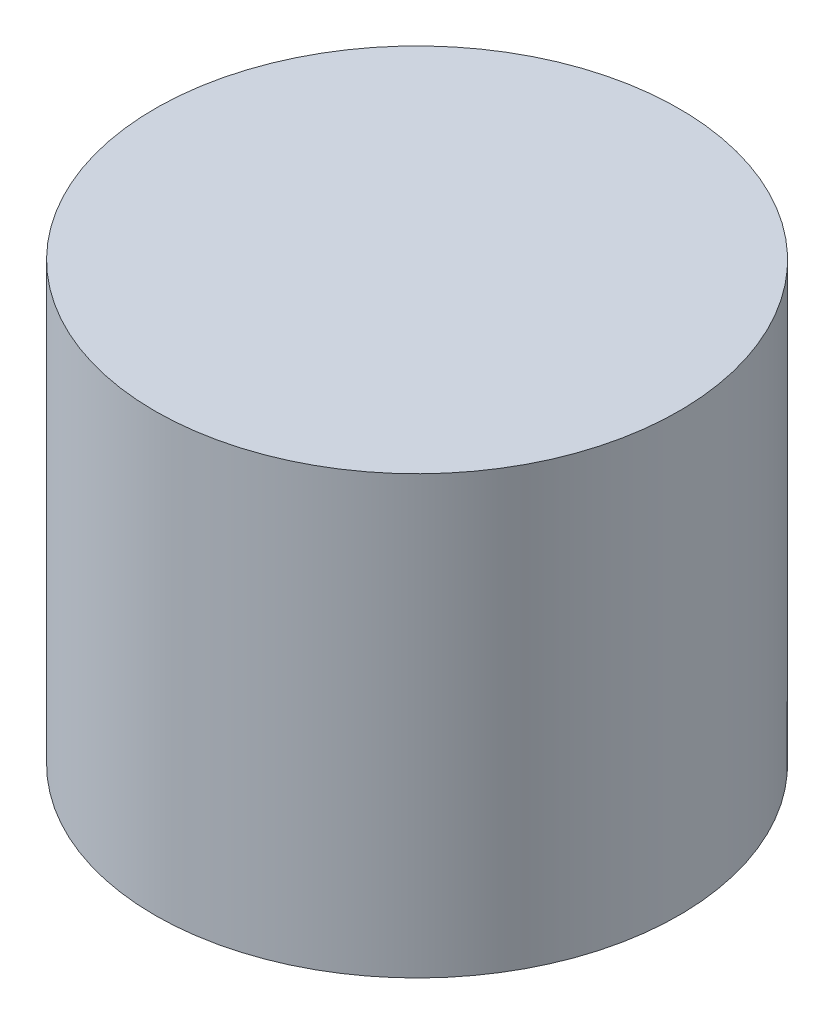
ISO-10303-21;
HEADER;
FILE_DESCRIPTION(('STEP AP214'),'2;1');
FILE_NAME('part.step','',(''),(''),'','','');
FILE_SCHEMA(('AUTOMOTIVE_DESIGN { 1 0 10303 214 1 1 1 1 }'));
ENDSEC;
DATA;
#1=APPLICATION_CONTEXT('core data for automotive mechanical design processes');
#2=APPLICATION_PROTOCOL_DEFINITION('international standard','automotive_design',2000,#1);
#3=PRODUCT_CONTEXT('',#1,'mechanical');
#4=PRODUCT('Part','Part','',(#3));
#5=PRODUCT_RELATED_PRODUCT_CATEGORY('part','',(#4));
#6=PRODUCT_DEFINITION_FORMATION('','',#4);
#7=PRODUCT_DEFINITION_CONTEXT('part definition',#1,'design');
#8=PRODUCT_DEFINITION('design','',#6,#7);
#9=PRODUCT_DEFINITION_SHAPE('','',#8);
#10=(LENGTH_UNIT() NAMED_UNIT(*) SI_UNIT(.MILLI.,.METRE.));
#11=(NAMED_UNIT(*) PLANE_ANGLE_UNIT() SI_UNIT($,.RADIAN.));
#12=(NAMED_UNIT(*) SI_UNIT($,.STERADIAN.) SOLID_ANGLE_UNIT());
#13=UNCERTAINTY_MEASURE_WITH_UNIT(LENGTH_MEASURE(1.E-05),#10,'distance_accuracy_value','');
#14=(GEOMETRIC_REPRESENTATION_CONTEXT(3) GLOBAL_UNCERTAINTY_ASSIGNED_CONTEXT((#13)) GLOBAL_UNIT_ASSIGNED_CONTEXT((#10,
#11,#12)) REPRESENTATION_CONTEXT('',''));
#15=CARTESIAN_POINT('',(0.,0.,0.));
#16=DIRECTION('',(0.,0.,1.));
#17=DIRECTION('',(1.,0.,0.));
#18=AXIS2_PLACEMENT_3D('',#15,#16,#17);
#19=CARTESIAN_POINT('',(0.,25.,0.));
#20=DIRECTION('',(0.,-1.,0.));
#21=DIRECTION('',(0.,0.,-1.));
#22=AXIS2_PLACEMENT_3D('',#19,#20,#21);
#23=CYLINDRICAL_SURFACE('',#22,15.);
#24=CARTESIAN_POINT('',(0.,25.,0.));
#25=DIRECTION('',(0.,1.,0.));
#26=DIRECTION('',(0.,0.,1.));
#27=AXIS2_PLACEMENT_3D('',#24,#25,#26);
#28=CIRCLE('',#27,15.);
#29=CARTESIAN_POINT('',(0.,25.,15.));
#30=VERTEX_POINT('',#29);
#31=EDGE_CURVE('E10',#30,#30,#28,.T.);
#32=ORIENTED_EDGE('',*,*,#31,.F.);
#33=EDGE_LOOP('',(#32));
#34=FACE_BOUND('',#33,.T.);
#35=CARTESIAN_POINT('',(0.,0.,0.));
#36=DIRECTION('',(0.,1.,0.));
#37=DIRECTION('',(0.,0.,1.));
#38=AXIS2_PLACEMENT_3D('',#35,#36,#37);
#39=CIRCLE('',#38,15.);
#40=CARTESIAN_POINT('',(0.,0.,15.));
#41=VERTEX_POINT('',#40);
#42=EDGE_CURVE('E35',#41,#41,#39,.T.);
#43=ORIENTED_EDGE('',*,*,#42,.T.);
#44=EDGE_LOOP('',(#43));
#45=FACE_BOUND('',#44,.T.);
#46=ADVANCED_FACE('F32',(#34,#45),#23,.T.);
#47=CARTESIAN_POINT('',(0.,25.,0.));
#48=DIRECTION('',(0.,1.,0.));
#49=DIRECTION('',(0.,0.,1.));
#50=AXIS2_PLACEMENT_3D('',#47,#48,#49);
#51=PLANE('',#50);
#52=ORIENTED_EDGE('',*,*,#31,.T.);
#53=EDGE_LOOP('',(#52));
#54=FACE_BOUND('',#53,.T.);
#55=ADVANCED_FACE('F47',(#54),#51,.T.);
#56=CARTESIAN_POINT('',(0.,0.,0.));
#57=DIRECTION('',(0.,1.,0.));
#58=DIRECTION('',(0.,0.,1.));
#59=AXIS2_PLACEMENT_3D('',#56,#57,#58);
#60=PLANE('',#59);
#61=ORIENTED_EDGE('',*,*,#42,.F.);
#62=EDGE_LOOP('',(#61));
#63=FACE_BOUND('',#62,.T.);
#64=ADVANCED_FACE('F45',(#63),#60,.F.);
#65=CLOSED_SHELL('',(#46,#55,#64));
#66=MANIFOLD_SOLID_BREP('B2',#65);
#67=ADVANCED_BREP_SHAPE_REPRESENTATION('',(#18,#66),#14);
#68=SHAPE_DEFINITION_REPRESENTATION(#9,#67);
ENDSEC;
END-ISO-10303-21;
